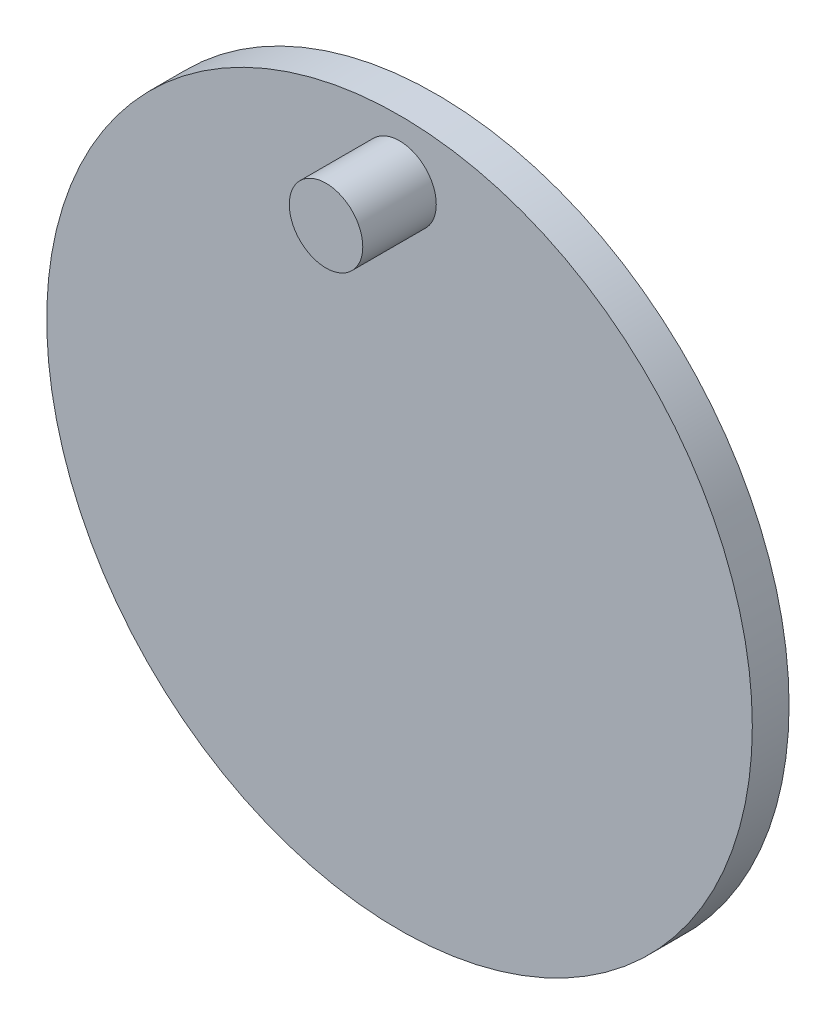
ISO-10303-21;
HEADER;
FILE_DESCRIPTION(('STEP AP214'),'2;1');
FILE_NAME('part.step','',(''),(''),'','','');
FILE_SCHEMA(('AUTOMOTIVE_DESIGN { 1 0 10303 214 1 1 1 1 }'));
ENDSEC;
DATA;
#1=APPLICATION_CONTEXT('core data for automotive mechanical design processes');
#2=APPLICATION_PROTOCOL_DEFINITION('international standard','automotive_design',2000,#1);
#3=PRODUCT_CONTEXT('',#1,'mechanical');
#4=PRODUCT('Part','Part','',(#3));
#5=PRODUCT_RELATED_PRODUCT_CATEGORY('part','',(#4));
#6=PRODUCT_DEFINITION_FORMATION('','',#4);
#7=PRODUCT_DEFINITION_CONTEXT('part definition',#1,'design');
#8=PRODUCT_DEFINITION('design','',#6,#7);
#9=PRODUCT_DEFINITION_SHAPE('','',#8);
#10=(LENGTH_UNIT() NAMED_UNIT(*) SI_UNIT(.MILLI.,.METRE.));
#11=(NAMED_UNIT(*) PLANE_ANGLE_UNIT() SI_UNIT($,.RADIAN.));
#12=(NAMED_UNIT(*) SI_UNIT($,.STERADIAN.) SOLID_ANGLE_UNIT());
#13=UNCERTAINTY_MEASURE_WITH_UNIT(LENGTH_MEASURE(1.E-05),#10,'distance_accuracy_value','');
#14=(GEOMETRIC_REPRESENTATION_CONTEXT(3) GLOBAL_UNCERTAINTY_ASSIGNED_CONTEXT((#13)) GLOBAL_UNIT_ASSIGNED_CONTEXT((#10,
#11,#12)) REPRESENTATION_CONTEXT('',''));
#15=CARTESIAN_POINT('',(0.,0.,0.));
#16=DIRECTION('',(0.,0.,1.));
#17=DIRECTION('',(1.,0.,0.));
#18=AXIS2_PLACEMENT_3D('',#15,#16,#17);
#19=CARTESIAN_POINT('',(0.,0.,5.));
#20=DIRECTION('',(0.,0.,-1.));
#21=DIRECTION('',(-1.,0.,0.));
#22=AXIS2_PLACEMENT_3D('',#19,#20,#21);
#23=CYLINDRICAL_SURFACE('',#22,48.);
#24=CARTESIAN_POINT('',(0.,0.,5.));
#25=DIRECTION('',(0.,0.,1.));
#26=DIRECTION('',(1.,0.,0.));
#27=AXIS2_PLACEMENT_3D('',#24,#25,#26);
#28=CIRCLE('',#27,48.);
#29=CARTESIAN_POINT('',(48.,0.,5.));
#30=VERTEX_POINT('',#29);
#31=EDGE_CURVE('E42',#30,#30,#28,.T.);
#32=ORIENTED_EDGE('',*,*,#31,.F.);
#33=EDGE_LOOP('',(#32));
#34=FACE_BOUND('',#33,.T.);
#35=CARTESIAN_POINT('',(0.,0.,0.));
#36=DIRECTION('',(0.,0.,1.));
#37=DIRECTION('',(1.,0.,0.));
#38=AXIS2_PLACEMENT_3D('',#35,#36,#37);
#39=CIRCLE('',#38,48.);
#40=CARTESIAN_POINT('',(48.,0.,0.));
#41=VERTEX_POINT('',#40);
#42=EDGE_CURVE('E37',#41,#41,#39,.T.);
#43=ORIENTED_EDGE('',*,*,#42,.T.);
#44=EDGE_LOOP('',(#43));
#45=FACE_BOUND('',#44,.T.);
#46=ADVANCED_FACE('F40',(#34,#45),#23,.T.);
#47=CARTESIAN_POINT('',(0.,0.,5.));
#48=DIRECTION('',(0.,0.,1.));
#49=DIRECTION('',(1.,0.,0.));
#50=AXIS2_PLACEMENT_3D('',#47,#48,#49);
#51=PLANE('',#50);
#52=CARTESIAN_POINT('',(0.,40.,5.));
#53=DIRECTION('',(0.,0.,1.));
#54=DIRECTION('',(1.,0.,0.));
#55=AXIS2_PLACEMENT_3D('',#52,#53,#54);
#56=CIRCLE('',#55,5.);
#57=CARTESIAN_POINT('',(5.,40.,5.));
#58=VERTEX_POINT('',#57);
#59=EDGE_CURVE('E54',#58,#58,#56,.F.);
#60=ORIENTED_EDGE('',*,*,#59,.T.);
#61=EDGE_LOOP('',(#60));
#62=FACE_BOUND('',#61,.T.);
#63=ORIENTED_EDGE('',*,*,#31,.T.);
#64=EDGE_LOOP('',(#63));
#65=FACE_BOUND('',#64,.T.);
#66=ADVANCED_FACE('F68',(#62,#65),#51,.T.);
#67=CARTESIAN_POINT('',(0.,0.,0.));
#68=DIRECTION('',(0.,0.,1.));
#69=DIRECTION('',(1.,0.,0.));
#70=AXIS2_PLACEMENT_3D('',#67,#68,#69);
#71=PLANE('',#70);
#72=CARTESIAN_POINT('',(0.,0.,0.));
#73=DIRECTION('',(0.,0.,-1.));
#74=DIRECTION('',(-1.,0.,0.));
#75=AXIS2_PLACEMENT_3D('',#72,#73,#74);
#76=CIRCLE('',#75,10.);
#77=CARTESIAN_POINT('',(-10.,0.,0.));
#78=VERTEX_POINT('',#77);
#79=EDGE_CURVE('E10',#78,#78,#76,.T.);
#80=ORIENTED_EDGE('',*,*,#79,.F.);
#81=EDGE_LOOP('',(#80));
#82=FACE_BOUND('',#81,.T.);
#83=ORIENTED_EDGE('',*,*,#42,.F.);
#84=EDGE_LOOP('',(#83));
#85=FACE_BOUND('',#84,.T.);
#86=ADVANCED_FACE('F65',(#82,#85),#71,.F.);
#87=CARTESIAN_POINT('',(0.,40.,15.));
#88=DIRECTION('',(0.,0.,-1.));
#89=DIRECTION('',(-1.,0.,0.));
#90=AXIS2_PLACEMENT_3D('',#87,#88,#89);
#91=CYLINDRICAL_SURFACE('',#90,5.);
#92=ORIENTED_EDGE('',*,*,#59,.F.);
#93=EDGE_LOOP('',(#92));
#94=FACE_BOUND('',#93,.T.);
#95=CARTESIAN_POINT('',(0.,40.,15.));
#96=DIRECTION('',(0.,0.,1.));
#97=DIRECTION('',(1.,0.,0.));
#98=AXIS2_PLACEMENT_3D('',#95,#96,#97);
#99=CIRCLE('',#98,5.);
#100=CARTESIAN_POINT('',(5.,40.,15.));
#101=VERTEX_POINT('',#100);
#102=EDGE_CURVE('E55',#101,#101,#99,.T.);
#103=ORIENTED_EDGE('',*,*,#102,.F.);
#104=EDGE_LOOP('',(#103));
#105=FACE_BOUND('',#104,.T.);
#106=ADVANCED_FACE('F62',(#94,#105),#91,.T.);
#107=CARTESIAN_POINT('',(0.,0.,15.));
#108=DIRECTION('',(0.,0.,1.));
#109=DIRECTION('',(1.,0.,0.));
#110=AXIS2_PLACEMENT_3D('',#107,#108,#109);
#111=PLANE('',#110);
#112=ORIENTED_EDGE('',*,*,#102,.T.);
#113=EDGE_LOOP('',(#112));
#114=FACE_BOUND('',#113,.T.);
#115=ADVANCED_FACE('F71',(#114),#111,.T.);
#116=CARTESIAN_POINT('',(0.,0.,-10.));
#117=DIRECTION('',(0.,0.,1.));
#118=DIRECTION('',(1.,0.,0.));
#119=AXIS2_PLACEMENT_3D('',#116,#117,#118);
#120=CYLINDRICAL_SURFACE('',#119,10.);
#121=CARTESIAN_POINT('',(0.,0.,-10.));
#122=DIRECTION('',(0.,0.,-1.));
#123=DIRECTION('',(-1.,0.,0.));
#124=AXIS2_PLACEMENT_3D('',#121,#122,#123);
#125=CIRCLE('',#124,10.);
#126=CARTESIAN_POINT('',(-10.,0.,-10.));
#127=VERTEX_POINT('',#126);
#128=EDGE_CURVE('E51',#127,#127,#125,.T.);
#129=ORIENTED_EDGE('',*,*,#128,.F.);
#130=EDGE_LOOP('',(#129));
#131=FACE_BOUND('',#130,.T.);
#132=ORIENTED_EDGE('',*,*,#79,.T.);
#133=EDGE_LOOP('',(#132));
#134=FACE_BOUND('',#133,.T.);
#135=ADVANCED_FACE('F97',(#131,#134),#120,.T.);
#136=CARTESIAN_POINT('',(0.,0.,-10.));
#137=DIRECTION('',(0.,0.,-1.));
#138=DIRECTION('',(-1.,0.,0.));
#139=AXIS2_PLACEMENT_3D('',#136,#137,#138);
#140=PLANE('',#139);
#141=ORIENTED_EDGE('',*,*,#128,.T.);
#142=EDGE_LOOP('',(#141));
#143=FACE_BOUND('',#142,.T.);
#144=ADVANCED_FACE('F112',(#143),#140,.T.);
#145=CLOSED_SHELL('',(#46,#66,#86,#106,#115,#135,#144));
#146=MANIFOLD_SOLID_BREP('B2',#145);
#147=ADVANCED_BREP_SHAPE_REPRESENTATION('',(#18,#146),#14);
#148=SHAPE_DEFINITION_REPRESENTATION(#9,#147);
ENDSEC;
END-ISO-10303-21;
